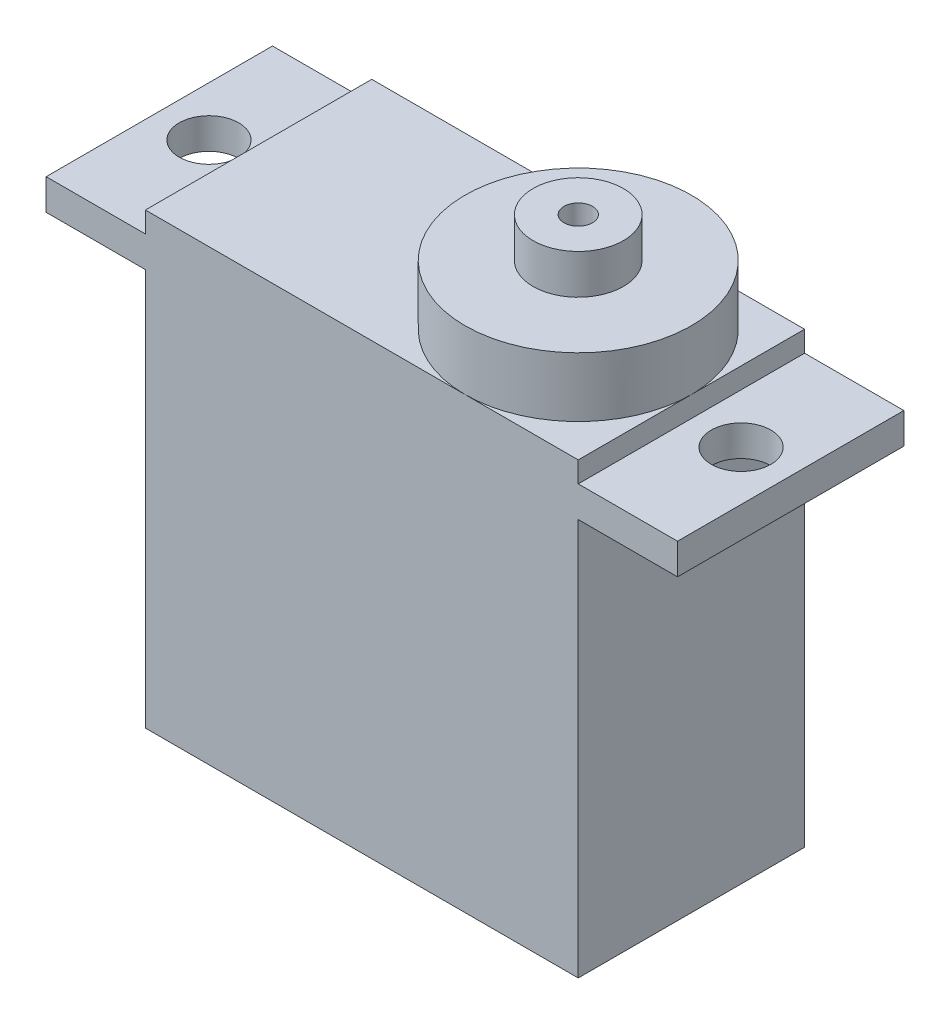
ISO-10303-21;
HEADER;
FILE_DESCRIPTION(('STEP AP214'),'2;1');
FILE_NAME('part.step','',(''),(''),'','','');
FILE_SCHEMA(('AUTOMOTIVE_DESIGN { 1 0 10303 214 1 1 1 1 }'));
ENDSEC;
DATA;
#1=APPLICATION_CONTEXT('core data for automotive mechanical design processes');
#2=APPLICATION_PROTOCOL_DEFINITION('international standard','automotive_design',2000,#1);
#3=PRODUCT_CONTEXT('',#1,'mechanical');
#4=PRODUCT('Part','Part','',(#3));
#5=PRODUCT_RELATED_PRODUCT_CATEGORY('part','',(#4));
#6=PRODUCT_DEFINITION_FORMATION('','',#4);
#7=PRODUCT_DEFINITION_CONTEXT('part definition',#1,'design');
#8=PRODUCT_DEFINITION('design','',#6,#7);
#9=PRODUCT_DEFINITION_SHAPE('','',#8);
#10=(LENGTH_UNIT() NAMED_UNIT(*) SI_UNIT(.MILLI.,.METRE.));
#11=(NAMED_UNIT(*) PLANE_ANGLE_UNIT() SI_UNIT($,.RADIAN.));
#12=(NAMED_UNIT(*) SI_UNIT($,.STERADIAN.) SOLID_ANGLE_UNIT());
#13=UNCERTAINTY_MEASURE_WITH_UNIT(LENGTH_MEASURE(1.E-05),#10,'distance_accuracy_value','');
#14=(GEOMETRIC_REPRESENTATION_CONTEXT(3) GLOBAL_UNCERTAINTY_ASSIGNED_CONTEXT((#13)) GLOBAL_UNIT_ASSIGNED_CONTEXT((#10,
#11,#12)) REPRESENTATION_CONTEXT('',''));
#15=CARTESIAN_POINT('',(0.,0.,0.));
#16=DIRECTION('',(0.,0.,1.));
#17=DIRECTION('',(1.,0.,0.));
#18=AXIS2_PLACEMENT_3D('',#15,#16,#17);
#19=CARTESIAN_POINT('',(-10.9,11.3,11.4));
#20=DIRECTION('',(0.,-1.,0.));
#21=DIRECTION('',(0.,0.,-1.));
#22=AXIS2_PLACEMENT_3D('',#19,#20,#21);
#23=PLANE('',#22);
#24=CARTESIAN_POINT('',(5.20000000000002,11.3,5.7));
#25=DIRECTION('',(0.,1.,0.));
#26=DIRECTION('',(0.,0.,1.));
#27=AXIS2_PLACEMENT_3D('',#24,#25,#26);
#28=CIRCLE('',#27,5.7);
#29=CARTESIAN_POINT('',(5.20000000000002,11.3,11.4));
#30=VERTEX_POINT('',#29);
#31=CARTESIAN_POINT('',(10.9,11.3,5.7));
#32=VERTEX_POINT('',#31);
#33=EDGE_CURVE('E43',#30,#32,#28,.T.);
#34=ORIENTED_EDGE('',*,*,#33,.F.);
#35=DIRECTION('',(-1.,0.,0.));
#36=VECTOR('',#35,1.);
#37=CARTESIAN_POINT('',(-10.9,11.3,11.4));
#38=LINE('',#37,#36);
#39=CARTESIAN_POINT('',(10.9,11.3,11.4));
#40=VERTEX_POINT('',#39);
#41=EDGE_CURVE('E131',#40,#30,#38,.T.);
#42=ORIENTED_EDGE('',*,*,#41,.F.);
#43=DIRECTION('',(0.,0.,-1.));
#44=VECTOR('',#43,1.);
#45=CARTESIAN_POINT('',(10.9,11.3,11.4));
#46=LINE('',#45,#44);
#47=EDGE_CURVE('E150',#40,#32,#46,.T.);
#48=ORIENTED_EDGE('',*,*,#47,.T.);
#49=EDGE_LOOP('',(#34,#42,#48));
#50=FACE_BOUND('',#49,.T.);
#51=ADVANCED_FACE('F32',(#50),#23,.F.);
#52=CARTESIAN_POINT('',(5.20000000000002,11.3,0.));
#53=VERTEX_POINT('',#52);
#54=EDGE_CURVE('E11',#32,#53,#28,.T.);
#55=ORIENTED_EDGE('',*,*,#54,.F.);
#56=CARTESIAN_POINT('',(10.9,11.3,0.));
#57=VERTEX_POINT('',#56);
#58=EDGE_CURVE('E155',#32,#57,#46,.T.);
#59=ORIENTED_EDGE('',*,*,#58,.T.);
#60=DIRECTION('',(-1.,0.,0.));
#61=VECTOR('',#60,1.);
#62=CARTESIAN_POINT('',(-10.9,11.3,0.));
#63=LINE('',#62,#61);
#64=EDGE_CURVE('E215',#57,#53,#63,.T.);
#65=ORIENTED_EDGE('',*,*,#64,.T.);
#66=EDGE_LOOP('',(#55,#59,#65));
#67=FACE_BOUND('',#66,.T.);
#68=ADVANCED_FACE('F230',(#67),#23,.F.);
#69=CARTESIAN_POINT('',(10.9,11.3,11.4));
#70=DIRECTION('',(-1.,0.,0.));
#71=DIRECTION('',(0.,-1.,0.));
#72=AXIS2_PLACEMENT_3D('',#69,#70,#71);
#73=PLANE('',#72);
#74=DIRECTION('',(0.,1.,0.));
#75=VECTOR('',#74,1.);
#76=CARTESIAN_POINT('',(10.9,11.3,0.));
#77=LINE('',#76,#75);
#78=CARTESIAN_POINT('',(10.9,-11.3,0.));
#79=VERTEX_POINT('',#78);
#80=CARTESIAN_POINT('',(10.9,8.69732125359592,0.));
#81=VERTEX_POINT('',#80);
#82=EDGE_CURVE('E212',#79,#81,#77,.T.);
#83=ORIENTED_EDGE('',*,*,#82,.T.);
#84=DIRECTION('',(0.,0.,1.));
#85=VECTOR('',#84,1.);
#86=CARTESIAN_POINT('',(10.9,8.69732125359592,11.4));
#87=LINE('',#86,#85);
#88=CARTESIAN_POINT('',(10.9,8.69732125359592,11.4));
#89=VERTEX_POINT('',#88);
#90=EDGE_CURVE('E202',#81,#89,#87,.T.);
#91=ORIENTED_EDGE('',*,*,#90,.T.);
#92=DIRECTION('',(0.,1.,0.));
#93=VECTOR('',#92,1.);
#94=CARTESIAN_POINT('',(10.9,11.3,11.4));
#95=LINE('',#94,#93);
#96=CARTESIAN_POINT('',(10.9,-11.3,11.4));
#97=VERTEX_POINT('',#96);
#98=EDGE_CURVE('E148',#97,#89,#95,.T.);
#99=ORIENTED_EDGE('',*,*,#98,.F.);
#100=DIRECTION('',(0.,0.,-1.));
#101=VECTOR('',#100,1.);
#102=CARTESIAN_POINT('',(10.9,-11.3,11.4));
#103=LINE('',#102,#101);
#104=EDGE_CURVE('E211',#97,#79,#103,.T.);
#105=ORIENTED_EDGE('',*,*,#104,.T.);
#106=EDGE_LOOP('',(#83,#91,#99,#105));
#107=FACE_BOUND('',#106,.T.);
#108=ADVANCED_FACE('F266',(#107),#73,.F.);
#109=CARTESIAN_POINT('',(-10.9,11.3,11.4));
#110=DIRECTION('',(1.,0.,0.));
#111=DIRECTION('',(0.,1.,0.));
#112=AXIS2_PLACEMENT_3D('',#109,#110,#111);
#113=PLANE('',#112);
#114=DIRECTION('',(0.,-1.,0.));
#115=VECTOR('',#114,1.);
#116=CARTESIAN_POINT('',(-10.9,11.3,11.4));
#117=LINE('',#116,#115);
#118=CARTESIAN_POINT('',(-10.9,8.69732125359592,11.4));
#119=VERTEX_POINT('',#118);
#120=CARTESIAN_POINT('',(-10.9,-11.3,11.4));
#121=VERTEX_POINT('',#120);
#122=EDGE_CURVE('E142',#119,#121,#117,.T.);
#123=ORIENTED_EDGE('',*,*,#122,.F.);
#124=DIRECTION('',(0.,0.,-1.));
#125=VECTOR('',#124,1.);
#126=CARTESIAN_POINT('',(-10.9,8.69732125359592,11.4));
#127=LINE('',#126,#125);
#128=CARTESIAN_POINT('',(-10.9,8.69732125359592,0.));
#129=VERTEX_POINT('',#128);
#130=EDGE_CURVE('E199',#119,#129,#127,.T.);
#131=ORIENTED_EDGE('',*,*,#130,.T.);
#132=DIRECTION('',(0.,-1.,0.));
#133=VECTOR('',#132,1.);
#134=CARTESIAN_POINT('',(-10.9,11.3,0.));
#135=LINE('',#134,#133);
#136=CARTESIAN_POINT('',(-10.9,-11.3,0.));
#137=VERTEX_POINT('',#136);
#138=EDGE_CURVE('E217',#129,#137,#135,.T.);
#139=ORIENTED_EDGE('',*,*,#138,.T.);
#140=DIRECTION('',(0.,0.,-1.));
#141=VECTOR('',#140,1.);
#142=CARTESIAN_POINT('',(-10.9,-11.3,11.4));
#143=LINE('',#142,#141);
#144=EDGE_CURVE('E224',#121,#137,#143,.T.);
#145=ORIENTED_EDGE('',*,*,#144,.F.);
#146=EDGE_LOOP('',(#123,#131,#139,#145));
#147=FACE_BOUND('',#146,.T.);
#148=ADVANCED_FACE('F255',(#147),#113,.F.);
#149=CARTESIAN_POINT('',(10.9,10.2529146681714,11.4));
#150=VERTEX_POINT('',#149);
#151=EDGE_CURVE('E137',#150,#40,#95,.T.);
#152=ORIENTED_EDGE('',*,*,#151,.F.);
#153=DIRECTION('',(0.,0.,-1.));
#154=VECTOR('',#153,1.);
#155=CARTESIAN_POINT('',(10.9,10.2529146681714,11.4));
#156=LINE('',#155,#154);
#157=CARTESIAN_POINT('',(10.9,10.2529146681714,0.));
#158=VERTEX_POINT('',#157);
#159=EDGE_CURVE('E196',#150,#158,#156,.T.);
#160=ORIENTED_EDGE('',*,*,#159,.T.);
#161=EDGE_CURVE('E204',#158,#57,#77,.T.);
#162=ORIENTED_EDGE('',*,*,#161,.T.);
#163=ORIENTED_EDGE('',*,*,#58,.F.);
#164=ORIENTED_EDGE('',*,*,#47,.F.);
#165=EDGE_LOOP('',(#152,#160,#162,#163,#164));
#166=FACE_BOUND('',#165,.T.);
#167=ADVANCED_FACE('F34',(#166),#73,.F.);
#168=EDGE_CURVE('E41',#53,#30,#28,.T.);
#169=ORIENTED_EDGE('',*,*,#168,.F.);
#170=CARTESIAN_POINT('',(-10.9,11.3,0.));
#171=VERTEX_POINT('',#170);
#172=EDGE_CURVE('E214',#53,#171,#63,.T.);
#173=ORIENTED_EDGE('',*,*,#172,.T.);
#174=DIRECTION('',(0.,0.,-1.));
#175=VECTOR('',#174,1.);
#176=CARTESIAN_POINT('',(-10.9,11.3,11.4));
#177=LINE('',#176,#175);
#178=CARTESIAN_POINT('',(-10.9,11.3,11.4));
#179=VERTEX_POINT('',#178);
#180=EDGE_CURVE('E146',#179,#171,#177,.T.);
#181=ORIENTED_EDGE('',*,*,#180,.F.);
#182=EDGE_CURVE('E134',#30,#179,#38,.T.);
#183=ORIENTED_EDGE('',*,*,#182,.F.);
#184=EDGE_LOOP('',(#169,#173,#181,#183));
#185=FACE_BOUND('',#184,.T.);
#186=ADVANCED_FACE('F144',(#185),#23,.F.);
#187=CARTESIAN_POINT('',(-10.9,10.2529146681714,0.));
#188=VERTEX_POINT('',#187);
#189=EDGE_CURVE('E218',#171,#188,#135,.T.);
#190=ORIENTED_EDGE('',*,*,#189,.T.);
#191=DIRECTION('',(0.,0.,1.));
#192=VECTOR('',#191,1.);
#193=CARTESIAN_POINT('',(-10.9,10.2529146681714,11.4));
#194=LINE('',#193,#192);
#195=CARTESIAN_POINT('',(-10.9,10.2529146681714,11.4));
#196=VERTEX_POINT('',#195);
#197=EDGE_CURVE('E194',#188,#196,#194,.T.);
#198=ORIENTED_EDGE('',*,*,#197,.T.);
#199=EDGE_CURVE('E207',#179,#196,#117,.T.);
#200=ORIENTED_EDGE('',*,*,#199,.F.);
#201=ORIENTED_EDGE('',*,*,#180,.T.);
#202=EDGE_LOOP('',(#190,#198,#200,#201));
#203=FACE_BOUND('',#202,.T.);
#204=ADVANCED_FACE('F239',(#203),#113,.F.);
#205=CARTESIAN_POINT('',(-10.9,-11.3,11.4));
#206=DIRECTION('',(0.,1.,0.));
#207=DIRECTION('',(0.,0.,1.));
#208=AXIS2_PLACEMENT_3D('',#205,#206,#207);
#209=PLANE('',#208);
#210=DIRECTION('',(1.,0.,0.));
#211=VECTOR('',#210,1.);
#212=CARTESIAN_POINT('',(-10.9,-11.3,0.));
#213=LINE('',#212,#211);
#214=EDGE_CURVE('E220',#137,#79,#213,.T.);
#215=ORIENTED_EDGE('',*,*,#214,.T.);
#216=ORIENTED_EDGE('',*,*,#104,.F.);
#217=DIRECTION('',(1.,0.,0.));
#218=VECTOR('',#217,1.);
#219=CARTESIAN_POINT('',(-10.9,-11.3,11.4));
#220=LINE('',#219,#218);
#221=EDGE_CURVE('E209',#121,#97,#220,.T.);
#222=ORIENTED_EDGE('',*,*,#221,.F.);
#223=ORIENTED_EDGE('',*,*,#144,.T.);
#224=EDGE_LOOP('',(#215,#216,#222,#223));
#225=FACE_BOUND('',#224,.T.);
#226=ADVANCED_FACE('F262',(#225),#209,.F.);
#227=CARTESIAN_POINT('',(0.,0.,11.4));
#228=DIRECTION('',(0.,0.,1.));
#229=DIRECTION('',(1.,0.,0.));
#230=AXIS2_PLACEMENT_3D('',#227,#228,#229);
#231=PLANE('',#230);
#232=ORIENTED_EDGE('',*,*,#199,.T.);
#233=DIRECTION('',(-1.,0.,0.));
#234=VECTOR('',#233,1.);
#235=CARTESIAN_POINT('',(-15.9,10.2529146681714,11.4));
#236=LINE('',#235,#234);
#237=CARTESIAN_POINT('',(-15.9,10.2529146681714,11.4));
#238=VERTEX_POINT('',#237);
#239=EDGE_CURVE('E177',#196,#238,#236,.T.);
#240=ORIENTED_EDGE('',*,*,#239,.T.);
#241=DIRECTION('',(0.,-1.,0.));
#242=VECTOR('',#241,1.);
#243=CARTESIAN_POINT('',(-15.9,10.2529146681714,11.4));
#244=LINE('',#243,#242);
#245=CARTESIAN_POINT('',(-15.9,8.69732125359592,11.4));
#246=VERTEX_POINT('',#245);
#247=EDGE_CURVE('E180',#238,#246,#244,.T.);
#248=ORIENTED_EDGE('',*,*,#247,.T.);
#249=DIRECTION('',(1.,0.,0.));
#250=VECTOR('',#249,1.);
#251=CARTESIAN_POINT('',(-15.9,8.69732125359592,11.4));
#252=LINE('',#251,#250);
#253=EDGE_CURVE('E170',#246,#119,#252,.T.);
#254=ORIENTED_EDGE('',*,*,#253,.T.);
#255=ORIENTED_EDGE('',*,*,#122,.T.);
#256=ORIENTED_EDGE('',*,*,#221,.T.);
#257=ORIENTED_EDGE('',*,*,#98,.T.);
#258=CARTESIAN_POINT('',(15.9,8.69732125359592,11.4));
#259=VERTEX_POINT('',#258);
#260=EDGE_CURVE('E174',#89,#259,#252,.T.);
#261=ORIENTED_EDGE('',*,*,#260,.T.);
#262=DIRECTION('',(0.,1.,0.));
#263=VECTOR('',#262,1.);
#264=CARTESIAN_POINT('',(15.9,10.2529146681714,11.4));
#265=LINE('',#264,#263);
#266=CARTESIAN_POINT('',(15.9,10.2529146681714,11.4));
#267=VERTEX_POINT('',#266);
#268=EDGE_CURVE('E173',#259,#267,#265,.T.);
#269=ORIENTED_EDGE('',*,*,#268,.T.);
#270=EDGE_CURVE('E178',#267,#150,#236,.T.);
#271=ORIENTED_EDGE('',*,*,#270,.T.);
#272=ORIENTED_EDGE('',*,*,#151,.T.);
#273=ORIENTED_EDGE('',*,*,#41,.T.);
#274=ORIENTED_EDGE('',*,*,#182,.T.);
#275=EDGE_LOOP('',(#232,#240,#248,#254,#255,#256,#257,#261,#269,#271,#272,#273,#274));
#276=FACE_BOUND('',#275,.T.);
#277=ADVANCED_FACE('F133',(#276),#231,.T.);
#278=CARTESIAN_POINT('',(0.,0.,0.));
#279=DIRECTION('',(0.,0.,1.));
#280=DIRECTION('',(1.,0.,0.));
#281=AXIS2_PLACEMENT_3D('',#278,#279,#280);
#282=PLANE('',#281);
#283=ORIENTED_EDGE('',*,*,#161,.F.);
#284=DIRECTION('',(1.,0.,0.));
#285=VECTOR('',#284,1.);
#286=CARTESIAN_POINT('',(-15.9,10.2529146681714,0.));
#287=LINE('',#286,#285);
#288=CARTESIAN_POINT('',(15.9,10.2529146681714,0.));
#289=VERTEX_POINT('',#288);
#290=EDGE_CURVE('E163',#158,#289,#287,.T.);
#291=ORIENTED_EDGE('',*,*,#290,.T.);
#292=DIRECTION('',(0.,-1.,0.));
#293=VECTOR('',#292,1.);
#294=CARTESIAN_POINT('',(15.9,10.2529146681714,0.));
#295=LINE('',#294,#293);
#296=CARTESIAN_POINT('',(15.9,8.69732125359592,0.));
#297=VERTEX_POINT('',#296);
#298=EDGE_CURVE('E169',#289,#297,#295,.T.);
#299=ORIENTED_EDGE('',*,*,#298,.T.);
#300=DIRECTION('',(-1.,0.,0.));
#301=VECTOR('',#300,1.);
#302=CARTESIAN_POINT('',(-15.9,8.69732125359592,0.));
#303=LINE('',#302,#301);
#304=EDGE_CURVE('E166',#297,#81,#303,.T.);
#305=ORIENTED_EDGE('',*,*,#304,.T.);
#306=ORIENTED_EDGE('',*,*,#82,.F.);
#307=ORIENTED_EDGE('',*,*,#214,.F.);
#308=ORIENTED_EDGE('',*,*,#138,.F.);
#309=CARTESIAN_POINT('',(-15.9,8.69732125359592,0.));
#310=VERTEX_POINT('',#309);
#311=EDGE_CURVE('E165',#129,#310,#303,.T.);
#312=ORIENTED_EDGE('',*,*,#311,.T.);
#313=DIRECTION('',(0.,1.,0.));
#314=VECTOR('',#313,1.);
#315=CARTESIAN_POINT('',(-15.9,10.2529146681714,0.));
#316=LINE('',#315,#314);
#317=CARTESIAN_POINT('',(-15.9,10.2529146681714,0.));
#318=VERTEX_POINT('',#317);
#319=EDGE_CURVE('E162',#310,#318,#316,.T.);
#320=ORIENTED_EDGE('',*,*,#319,.T.);
#321=EDGE_CURVE('E159',#318,#188,#287,.T.);
#322=ORIENTED_EDGE('',*,*,#321,.T.);
#323=ORIENTED_EDGE('',*,*,#189,.F.);
#324=ORIENTED_EDGE('',*,*,#172,.F.);
#325=ORIENTED_EDGE('',*,*,#64,.F.);
#326=EDGE_LOOP('',(#283,#291,#299,#305,#306,#307,#308,#312,#320,#322,#323,#324,#325));
#327=FACE_BOUND('',#326,.T.);
#328=ADVANCED_FACE('F236',(#327),#282,.F.);
#329=CARTESIAN_POINT('',(-15.9,10.2529146681714,-31.8380255491994));
#330=DIRECTION('',(-1.,0.,0.));
#331=DIRECTION('',(0.,0.,1.));
#332=AXIS2_PLACEMENT_3D('',#329,#330,#331);
#333=PLANE('',#332);
#334=ORIENTED_EDGE('',*,*,#319,.F.);
#335=DIRECTION('',(0.,0.,1.));
#336=VECTOR('',#335,1.);
#337=CARTESIAN_POINT('',(-15.9,8.69732125359592,-31.8380255491994));
#338=LINE('',#337,#336);
#339=EDGE_CURVE('E184',#310,#246,#338,.T.);
#340=ORIENTED_EDGE('',*,*,#339,.T.);
#341=ORIENTED_EDGE('',*,*,#247,.F.);
#342=DIRECTION('',(0.,0.,1.));
#343=VECTOR('',#342,1.);
#344=CARTESIAN_POINT('',(-15.9,10.2529146681714,-31.8380255491994));
#345=LINE('',#344,#343);
#346=EDGE_CURVE('E186',#318,#238,#345,.T.);
#347=ORIENTED_EDGE('',*,*,#346,.F.);
#348=EDGE_LOOP('',(#334,#340,#341,#347));
#349=FACE_BOUND('',#348,.T.);
#350=ADVANCED_FACE('F248',(#349),#333,.T.);
#351=CARTESIAN_POINT('',(-15.9,10.2529146681714,-31.8380255491994));
#352=DIRECTION('',(0.,1.,0.));
#353=DIRECTION('',(0.,0.,1.));
#354=AXIS2_PLACEMENT_3D('',#351,#352,#353);
#355=PLANE('',#354);
#356=CARTESIAN_POINT('',(-13.4,10.2529146681714,5.7));
#357=DIRECTION('',(0.,1.,0.));
#358=DIRECTION('',(0.,0.,1.));
#359=AXIS2_PLACEMENT_3D('',#356,#357,#358);
#360=CIRCLE('',#359,1.5);
#361=CARTESIAN_POINT('',(-13.4,10.2529146681714,7.2));
#362=VERTEX_POINT('',#361);
#363=EDGE_CURVE('E485',#362,#362,#360,.T.);
#364=ORIENTED_EDGE('',*,*,#363,.F.);
#365=EDGE_LOOP('',(#364));
#366=FACE_BOUND('',#365,.T.);
#367=ORIENTED_EDGE('',*,*,#197,.F.);
#368=ORIENTED_EDGE('',*,*,#321,.F.);
#369=ORIENTED_EDGE('',*,*,#346,.T.);
#370=ORIENTED_EDGE('',*,*,#239,.F.);
#371=EDGE_LOOP('',(#367,#368,#369,#370));
#372=FACE_BOUND('',#371,.T.);
#373=ADVANCED_FACE('F242',(#366,#372),#355,.T.);
#374=CARTESIAN_POINT('',(-15.9,8.69732125359592,-31.8380255491994));
#375=DIRECTION('',(0.,-1.,0.));
#376=DIRECTION('',(0.,0.,-1.));
#377=AXIS2_PLACEMENT_3D('',#374,#375,#376);
#378=PLANE('',#377);
#379=CARTESIAN_POINT('',(-13.4,8.69732125359592,5.7));
#380=DIRECTION('',(0.,-1.,0.));
#381=DIRECTION('',(0.,0.,-1.));
#382=AXIS2_PLACEMENT_3D('',#379,#380,#381);
#383=CIRCLE('',#382,1.5);
#384=CARTESIAN_POINT('',(-13.4,8.69732125359592,4.2));
#385=VERTEX_POINT('',#384);
#386=EDGE_CURVE('E36',#385,#385,#383,.T.);
#387=ORIENTED_EDGE('',*,*,#386,.F.);
#388=EDGE_LOOP('',(#387));
#389=FACE_BOUND('',#388,.T.);
#390=ORIENTED_EDGE('',*,*,#130,.F.);
#391=ORIENTED_EDGE('',*,*,#253,.F.);
#392=ORIENTED_EDGE('',*,*,#339,.F.);
#393=ORIENTED_EDGE('',*,*,#311,.F.);
#394=EDGE_LOOP('',(#390,#391,#392,#393));
#395=FACE_BOUND('',#394,.T.);
#396=ADVANCED_FACE('F253',(#389,#395),#378,.T.);
#397=CARTESIAN_POINT('',(13.3999999716799,8.69732125359592,5.69903620490499));
#398=DIRECTION('',(0.,-1.,0.));
#399=DIRECTION('',(0.,0.,-1.));
#400=AXIS2_PLACEMENT_3D('',#397,#398,#399);
#401=CIRCLE('',#400,1.5);
#402=CARTESIAN_POINT('',(13.3999999716799,8.69732125359592,4.19903620490499));
#403=VERTEX_POINT('',#402);
#404=EDGE_CURVE('E491',#403,#403,#401,.T.);
#405=ORIENTED_EDGE('',*,*,#404,.F.);
#406=EDGE_LOOP('',(#405));
#407=FACE_BOUND('',#406,.T.);
#408=ORIENTED_EDGE('',*,*,#90,.F.);
#409=ORIENTED_EDGE('',*,*,#304,.F.);
#410=DIRECTION('',(0.,0.,1.));
#411=VECTOR('',#410,1.);
#412=CARTESIAN_POINT('',(15.9,8.69732125359592,-31.8380255491994));
#413=LINE('',#412,#411);
#414=EDGE_CURVE('E183',#297,#259,#413,.T.);
#415=ORIENTED_EDGE('',*,*,#414,.T.);
#416=ORIENTED_EDGE('',*,*,#260,.F.);
#417=EDGE_LOOP('',(#408,#409,#415,#416));
#418=FACE_BOUND('',#417,.T.);
#419=ADVANCED_FACE('F270',(#407,#418),#378,.T.);
#420=CARTESIAN_POINT('',(13.3999999716799,10.2529146681714,5.69903620490499));
#421=DIRECTION('',(0.,1.,0.));
#422=DIRECTION('',(0.,0.,1.));
#423=AXIS2_PLACEMENT_3D('',#420,#421,#422);
#424=CIRCLE('',#423,1.5);
#425=CARTESIAN_POINT('',(13.3999999716799,10.2529146681714,7.199036204905));
#426=VERTEX_POINT('',#425);
#427=EDGE_CURVE('E487',#426,#426,#424,.T.);
#428=ORIENTED_EDGE('',*,*,#427,.F.);
#429=EDGE_LOOP('',(#428));
#430=FACE_BOUND('',#429,.T.);
#431=ORIENTED_EDGE('',*,*,#159,.F.);
#432=ORIENTED_EDGE('',*,*,#270,.F.);
#433=DIRECTION('',(0.,0.,1.));
#434=VECTOR('',#433,1.);
#435=CARTESIAN_POINT('',(15.9,10.2529146681714,-31.8380255491994));
#436=LINE('',#435,#434);
#437=EDGE_CURVE('E189',#289,#267,#436,.T.);
#438=ORIENTED_EDGE('',*,*,#437,.F.);
#439=ORIENTED_EDGE('',*,*,#290,.F.);
#440=EDGE_LOOP('',(#431,#432,#438,#439));
#441=FACE_BOUND('',#440,.T.);
#442=ADVANCED_FACE('F292',(#430,#441),#355,.T.);
#443=CARTESIAN_POINT('',(15.9,10.2529146681714,-31.8380255491994));
#444=DIRECTION('',(1.,0.,0.));
#445=DIRECTION('',(0.,0.,-1.));
#446=AXIS2_PLACEMENT_3D('',#443,#444,#445);
#447=PLANE('',#446);
#448=ORIENTED_EDGE('',*,*,#298,.F.);
#449=ORIENTED_EDGE('',*,*,#437,.T.);
#450=ORIENTED_EDGE('',*,*,#268,.F.);
#451=ORIENTED_EDGE('',*,*,#414,.F.);
#452=EDGE_LOOP('',(#448,#449,#450,#451));
#453=FACE_BOUND('',#452,.T.);
#454=ADVANCED_FACE('F275',(#453),#447,.T.);
#455=CARTESIAN_POINT('',(5.20000000000002,14.3,5.7));
#456=DIRECTION('',(0.,-1.,0.));
#457=DIRECTION('',(0.,0.,-1.));
#458=AXIS2_PLACEMENT_3D('',#455,#456,#457);
#459=CYLINDRICAL_SURFACE('',#458,5.7);
#460=CARTESIAN_POINT('',(5.20000000000002,14.3,5.7));
#461=DIRECTION('',(0.,1.,0.));
#462=DIRECTION('',(0.,0.,1.));
#463=AXIS2_PLACEMENT_3D('',#460,#461,#462);
#464=CIRCLE('',#463,5.7);
#465=CARTESIAN_POINT('',(5.20000000000002,14.3,11.4));
#466=VERTEX_POINT('',#465);
#467=EDGE_CURVE('E152',#466,#466,#464,.T.);
#468=ORIENTED_EDGE('',*,*,#467,.F.);
#469=EDGE_LOOP('',(#468));
#470=FACE_BOUND('',#469,.T.);
#471=ORIENTED_EDGE('',*,*,#33,.T.);
#472=ORIENTED_EDGE('',*,*,#54,.T.);
#473=ORIENTED_EDGE('',*,*,#168,.T.);
#474=EDGE_LOOP('',(#471,#472,#473));
#475=FACE_BOUND('',#474,.T.);
#476=ADVANCED_FACE('F154',(#470,#475),#459,.T.);
#477=CARTESIAN_POINT('',(5.20000000000002,14.3,5.7));
#478=DIRECTION('',(0.,1.,0.));
#479=DIRECTION('',(0.,0.,1.));
#480=AXIS2_PLACEMENT_3D('',#477,#478,#479);
#481=PLANE('',#480);
#482=CARTESIAN_POINT('',(5.20000000000002,14.3,5.7));
#483=DIRECTION('',(0.,1.,0.));
#484=DIRECTION('',(0.,0.,1.));
#485=AXIS2_PLACEMENT_3D('',#482,#483,#484);
#486=CIRCLE('',#485,2.275);
#487=CARTESIAN_POINT('',(5.20000000000002,14.3,7.975));
#488=VERTEX_POINT('',#487);
#489=EDGE_CURVE('E498',#488,#488,#486,.T.);
#490=ORIENTED_EDGE('',*,*,#489,.F.);
#491=EDGE_LOOP('',(#490));
#492=FACE_BOUND('',#491,.T.);
#493=ORIENTED_EDGE('',*,*,#467,.T.);
#494=EDGE_LOOP('',(#493));
#495=FACE_BOUND('',#494,.T.);
#496=ADVANCED_FACE('F281',(#492,#495),#481,.T.);
#497=CARTESIAN_POINT('',(5.20000000000002,16.3,5.7));
#498=DIRECTION('',(0.,-1.,0.));
#499=DIRECTION('',(0.,0.,-1.));
#500=AXIS2_PLACEMENT_3D('',#497,#498,#499);
#501=CYLINDRICAL_SURFACE('',#500,2.275);
#502=CARTESIAN_POINT('',(5.20000000000002,16.3,5.7));
#503=DIRECTION('',(0.,1.,0.));
#504=DIRECTION('',(0.,0.,1.));
#505=AXIS2_PLACEMENT_3D('',#502,#503,#504);
#506=CIRCLE('',#505,2.275);
#507=CARTESIAN_POINT('',(5.20000000000002,16.3,7.975));
#508=VERTEX_POINT('',#507);
#509=EDGE_CURVE('E153',#508,#508,#506,.T.);
#510=ORIENTED_EDGE('',*,*,#509,.F.);
#511=EDGE_LOOP('',(#510));
#512=FACE_BOUND('',#511,.T.);
#513=ORIENTED_EDGE('',*,*,#489,.T.);
#514=EDGE_LOOP('',(#513));
#515=FACE_BOUND('',#514,.T.);
#516=ADVANCED_FACE('F289',(#512,#515),#501,.T.);
#517=CARTESIAN_POINT('',(5.20000000000002,16.3,5.7));
#518=DIRECTION('',(0.,1.,0.));
#519=DIRECTION('',(0.,0.,1.));
#520=AXIS2_PLACEMENT_3D('',#517,#518,#519);
#521=PLANE('',#520);
#522=CARTESIAN_POINT('',(5.20000000000002,16.3,5.7));
#523=DIRECTION('',(0.,1.,0.));
#524=DIRECTION('',(0.,0.,1.));
#525=AXIS2_PLACEMENT_3D('',#522,#523,#524);
#526=CIRCLE('',#525,0.717779634243647);
#527=CARTESIAN_POINT('',(5.20000000000002,16.3,6.41777963424365));
#528=VERTEX_POINT('',#527);
#529=EDGE_CURVE('E494',#528,#528,#526,.T.);
#530=ORIENTED_EDGE('',*,*,#529,.F.);
#531=EDGE_LOOP('',(#530));
#532=FACE_BOUND('',#531,.T.);
#533=ORIENTED_EDGE('',*,*,#509,.T.);
#534=EDGE_LOOP('',(#533));
#535=FACE_BOUND('',#534,.T.);
#536=ADVANCED_FACE('F396',(#532,#535),#521,.T.);
#537=CARTESIAN_POINT('',(5.20000000000002,13.9,5.7));
#538=DIRECTION('',(0.,1.,0.));
#539=DIRECTION('',(0.,0.,1.));
#540=AXIS2_PLACEMENT_3D('',#537,#538,#539);
#541=CYLINDRICAL_SURFACE('',#540,0.717779634243647);
#542=CARTESIAN_POINT('',(5.20000000000002,13.9,5.7));
#543=DIRECTION('',(0.,1.,0.));
#544=DIRECTION('',(0.,0.,1.));
#545=AXIS2_PLACEMENT_3D('',#542,#543,#544);
#546=CIRCLE('',#545,0.717779634243647);
#547=CARTESIAN_POINT('',(5.20000000000002,13.9,6.41777963424365));
#548=VERTEX_POINT('',#547);
#549=EDGE_CURVE('E495',#548,#548,#546,.T.);
#550=ORIENTED_EDGE('',*,*,#549,.F.);
#551=EDGE_LOOP('',(#550));
#552=FACE_BOUND('',#551,.T.);
#553=ORIENTED_EDGE('',*,*,#529,.T.);
#554=EDGE_LOOP('',(#553));
#555=FACE_BOUND('',#554,.T.);
#556=ADVANCED_FACE('F406',(#552,#555),#541,.F.);
#557=CARTESIAN_POINT('',(5.20000000000002,13.9,5.7));
#558=DIRECTION('',(0.,1.,0.));
#559=DIRECTION('',(0.,0.,1.));
#560=AXIS2_PLACEMENT_3D('',#557,#558,#559);
#561=PLANE('',#560);
#562=ORIENTED_EDGE('',*,*,#549,.T.);
#563=EDGE_LOOP('',(#562));
#564=FACE_BOUND('',#563,.T.);
#565=ADVANCED_FACE('F416',(#564),#561,.T.);
#566=CARTESIAN_POINT('',(13.3999999716799,0.252914668171398,5.69903620490499));
#567=DIRECTION('',(0.,1.,0.));
#568=DIRECTION('',(0.,0.,1.));
#569=AXIS2_PLACEMENT_3D('',#566,#567,#568);
#570=CYLINDRICAL_SURFACE('',#569,1.5);
#571=ORIENTED_EDGE('',*,*,#404,.T.);
#572=EDGE_LOOP('',(#571));
#573=FACE_BOUND('',#572,.T.);
#574=ORIENTED_EDGE('',*,*,#427,.T.);
#575=EDGE_LOOP('',(#574));
#576=FACE_BOUND('',#575,.T.);
#577=ADVANCED_FACE('F426',(#573,#576),#570,.F.);
#578=CARTESIAN_POINT('',(-13.4,0.252914668171398,5.7));
#579=DIRECTION('',(0.,1.,0.));
#580=DIRECTION('',(0.,0.,1.));
#581=AXIS2_PLACEMENT_3D('',#578,#579,#580);
#582=CYLINDRICAL_SURFACE('',#581,1.5);
#583=ORIENTED_EDGE('',*,*,#386,.T.);
#584=EDGE_LOOP('',(#583));
#585=FACE_BOUND('',#584,.T.);
#586=ORIENTED_EDGE('',*,*,#363,.T.);
#587=EDGE_LOOP('',(#586));
#588=FACE_BOUND('',#587,.T.);
#589=ADVANCED_FACE('F466',(#585,#588),#582,.F.);
#590=CLOSED_SHELL('',(#51,#68,#108,#148,#167,#186,#204,#226,#277,#328,#350,#373,#396,#419,#442,
#454,#476,#496,#516,#536,#556,#565,#577,#589));
#591=MANIFOLD_SOLID_BREP('B2',#590);
#592=ADVANCED_BREP_SHAPE_REPRESENTATION('',(#18,#591),#14);
#593=SHAPE_DEFINITION_REPRESENTATION(#9,#592);
ENDSEC;
END-ISO-10303-21;
